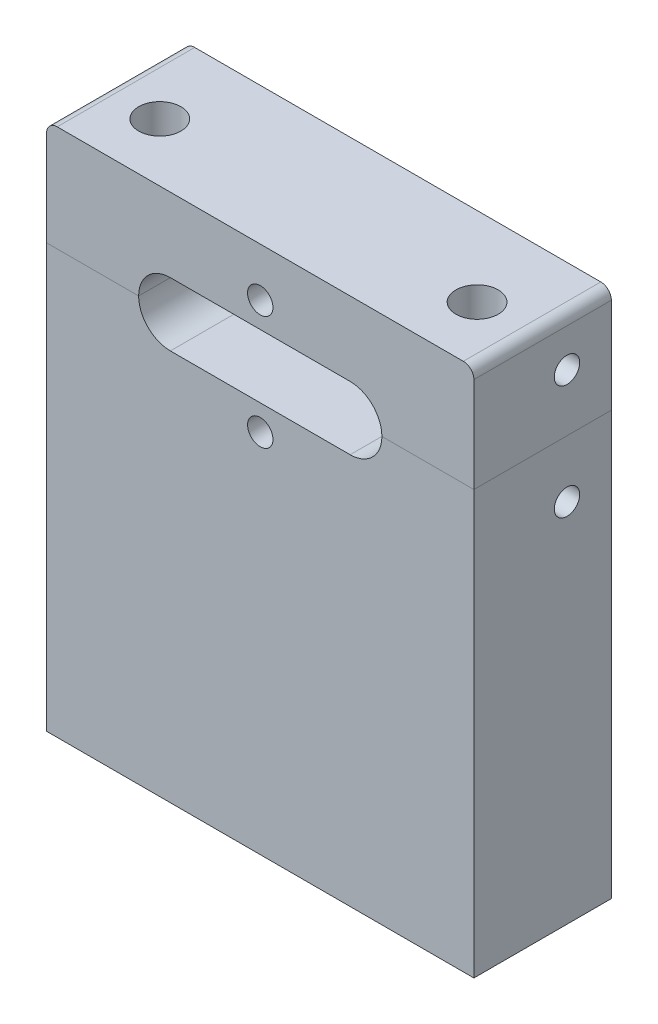
ISO-10303-21;
HEADER;
FILE_DESCRIPTION(('STEP AP214'),'2;1');
FILE_NAME('part.step','',(''),(''),'','','');
FILE_SCHEMA(('AUTOMOTIVE_DESIGN { 1 0 10303 214 1 1 1 1 }'));
ENDSEC;
DATA;
#1=APPLICATION_CONTEXT('core data for automotive mechanical design processes');
#2=APPLICATION_PROTOCOL_DEFINITION('international standard','automotive_design',2000,#1);
#3=PRODUCT_CONTEXT('',#1,'mechanical');
#4=PRODUCT('Part','Part','',(#3));
#5=PRODUCT_RELATED_PRODUCT_CATEGORY('part','',(#4));
#6=PRODUCT_DEFINITION_FORMATION('','',#4);
#7=PRODUCT_DEFINITION_CONTEXT('part definition',#1,'design');
#8=PRODUCT_DEFINITION('design','',#6,#7);
#9=PRODUCT_DEFINITION_SHAPE('','',#8);
#10=(LENGTH_UNIT() NAMED_UNIT(*) SI_UNIT(.MILLI.,.METRE.));
#11=(NAMED_UNIT(*) PLANE_ANGLE_UNIT() SI_UNIT($,.RADIAN.));
#12=(NAMED_UNIT(*) SI_UNIT($,.STERADIAN.) SOLID_ANGLE_UNIT());
#13=UNCERTAINTY_MEASURE_WITH_UNIT(LENGTH_MEASURE(1.E-05),#10,'distance_accuracy_value','');
#14=(GEOMETRIC_REPRESENTATION_CONTEXT(3) GLOBAL_UNCERTAINTY_ASSIGNED_CONTEXT((#13)) GLOBAL_UNIT_ASSIGNED_CONTEXT((#10,
#11,#12)) REPRESENTATION_CONTEXT('',''));
#15=CARTESIAN_POINT('',(0.,0.,0.));
#16=DIRECTION('',(0.,0.,1.));
#17=DIRECTION('',(1.,0.,0.));
#18=AXIS2_PLACEMENT_3D('',#15,#16,#17);
#19=CARTESIAN_POINT('',(0.,25.4,0.));
#20=DIRECTION('',(0.,1.,0.));
#21=DIRECTION('',(0.,0.,1.));
#22=AXIS2_PLACEMENT_3D('',#19,#20,#21);
#23=PLANE('',#22);
#24=DIRECTION('',(0.,0.,-1.));
#25=VECTOR('',#24,1.);
#26=CARTESIAN_POINT('',(-7.3025,25.4,21.2725));
#27=LINE('',#26,#25);
#28=CARTESIAN_POINT('',(-7.3025,25.4,4.1275));
#29=VERTEX_POINT('',#28);
#30=CARTESIAN_POINT('',(-7.3025,25.4,-4.1275));
#31=VERTEX_POINT('',#30);
#32=EDGE_CURVE('E130',#29,#31,#27,.T.);
#33=ORIENTED_EDGE('',*,*,#32,.T.);
#34=DIRECTION('',(-1.,0.,0.));
#35=VECTOR('',#34,1.);
#36=CARTESIAN_POINT('',(-12.827,25.4,-4.1275));
#37=LINE('',#36,#35);
#38=CARTESIAN_POINT('',(-12.827,25.4,-4.1275));
#39=VERTEX_POINT('',#38);
#40=EDGE_CURVE('E125',#31,#39,#37,.T.);
#41=ORIENTED_EDGE('',*,*,#40,.T.);
#42=DIRECTION('',(0.,0.,1.));
#43=VECTOR('',#42,1.);
#44=CARTESIAN_POINT('',(-12.827,25.4,4.1275));
#45=LINE('',#44,#43);
#46=CARTESIAN_POINT('',(-12.827,25.4,4.1275));
#47=VERTEX_POINT('',#46);
#48=EDGE_CURVE('E189',#39,#47,#45,.T.);
#49=ORIENTED_EDGE('',*,*,#48,.T.);
#50=DIRECTION('',(1.,0.,0.));
#51=VECTOR('',#50,1.);
#52=CARTESIAN_POINT('',(-12.827,25.4,4.1275));
#53=LINE('',#52,#51);
#54=EDGE_CURVE('E191',#47,#29,#53,.T.);
#55=ORIENTED_EDGE('',*,*,#54,.T.);
#56=EDGE_LOOP('',(#33,#41,#49,#55));
#57=FACE_BOUND('',#56,.T.);
#58=CARTESIAN_POINT('',(-9.525,25.4,0.635));
#59=DIRECTION('',(0.,1.,0.));
#60=DIRECTION('',(0.,0.,1.));
#61=AXIS2_PLACEMENT_3D('',#58,#59,#60);
#62=CIRCLE('',#61,1.27);
#63=CARTESIAN_POINT('',(-9.525,25.4,1.905));
#64=VERTEX_POINT('',#63);
#65=EDGE_CURVE('E137',#64,#64,#62,.F.);
#66=ORIENTED_EDGE('',*,*,#65,.T.);
#67=EDGE_LOOP('',(#66));
#68=FACE_BOUND('',#67,.T.);
#69=ADVANCED_FACE('F43',(#57,#68),#23,.T.);
#70=CARTESIAN_POINT('',(7.3025,25.4,4.1275));
#71=VERTEX_POINT('',#70);
#72=CARTESIAN_POINT('',(12.827,25.4,4.1275));
#73=VERTEX_POINT('',#72);
#74=EDGE_CURVE('E134',#71,#73,#53,.T.);
#75=ORIENTED_EDGE('',*,*,#74,.T.);
#76=DIRECTION('',(0.,0.,-1.));
#77=VECTOR('',#76,1.);
#78=CARTESIAN_POINT('',(12.827,25.4,4.1275));
#79=LINE('',#78,#77);
#80=CARTESIAN_POINT('',(12.827,25.4,-4.1275));
#81=VERTEX_POINT('',#80);
#82=EDGE_CURVE('E124',#73,#81,#79,.T.);
#83=ORIENTED_EDGE('',*,*,#82,.T.);
#84=CARTESIAN_POINT('',(7.3025,25.4,-4.1275));
#85=VERTEX_POINT('',#84);
#86=EDGE_CURVE('E113',#81,#85,#37,.T.);
#87=ORIENTED_EDGE('',*,*,#86,.T.);
#88=DIRECTION('',(0.,0.,-1.));
#89=VECTOR('',#88,1.);
#90=CARTESIAN_POINT('',(7.3025,25.4,21.2725));
#91=LINE('',#90,#89);
#92=EDGE_CURVE('E122',#85,#71,#91,.F.);
#93=ORIENTED_EDGE('',*,*,#92,.T.);
#94=EDGE_LOOP('',(#75,#83,#87,#93));
#95=FACE_BOUND('',#94,.T.);
#96=CARTESIAN_POINT('',(9.525,25.4,0.635));
#97=DIRECTION('',(0.,1.,0.));
#98=DIRECTION('',(0.,0.,1.));
#99=AXIS2_PLACEMENT_3D('',#96,#97,#98);
#100=CIRCLE('',#99,1.27);
#101=CARTESIAN_POINT('',(9.525,25.4,1.905));
#102=VERTEX_POINT('',#101);
#103=EDGE_CURVE('E131',#102,#102,#100,.F.);
#104=ORIENTED_EDGE('',*,*,#103,.T.);
#105=EDGE_LOOP('',(#104));
#106=FACE_BOUND('',#105,.T.);
#107=ADVANCED_FACE('F120',(#95,#106),#23,.T.);
#108=CARTESIAN_POINT('',(9.525,19.05,0.635));
#109=DIRECTION('',(0.,1.,0.));
#110=DIRECTION('',(0.,0.,1.));
#111=AXIS2_PLACEMENT_3D('',#108,#109,#110);
#112=PLANE('',#111);
#113=CARTESIAN_POINT('',(9.525,19.05,0.635));
#114=DIRECTION('',(0.,1.,0.));
#115=DIRECTION('',(0.,0.,1.));
#116=AXIS2_PLACEMENT_3D('',#113,#114,#115);
#117=CIRCLE('',#116,1.27);
#118=CARTESIAN_POINT('',(9.525,19.05,1.905));
#119=VERTEX_POINT('',#118);
#120=EDGE_CURVE('E52',#119,#119,#117,.T.);
#121=ORIENTED_EDGE('',*,*,#120,.T.);
#122=EDGE_LOOP('',(#121));
#123=FACE_BOUND('',#122,.T.);
#124=ADVANCED_FACE('F225',(#123),#112,.T.);
#125=CARTESIAN_POINT('',(9.525,19.05,0.635));
#126=DIRECTION('',(0.,1.,0.));
#127=DIRECTION('',(0.,0.,1.));
#128=AXIS2_PLACEMENT_3D('',#125,#126,#127);
#129=CYLINDRICAL_SURFACE('',#128,1.27);
#130=ORIENTED_EDGE('',*,*,#120,.F.);
#131=EDGE_LOOP('',(#130));
#132=FACE_BOUND('',#131,.T.);
#133=ORIENTED_EDGE('',*,*,#103,.F.);
#134=EDGE_LOOP('',(#133));
#135=FACE_BOUND('',#134,.T.);
#136=ADVANCED_FACE('F233',(#132,#135),#129,.F.);
#137=CARTESIAN_POINT('',(12.827,31.75,4.1275));
#138=DIRECTION('',(-1.,0.,0.));
#139=DIRECTION('',(0.,0.,1.));
#140=AXIS2_PLACEMENT_3D('',#137,#138,#139);
#141=PLANE('',#140);
#142=CARTESIAN_POINT('',(12.827,21.971,-1.4605));
#143=DIRECTION('',(1.,0.,0.));
#144=DIRECTION('',(0.,0.,-1.));
#145=AXIS2_PLACEMENT_3D('',#142,#143,#144);
#146=CIRCLE('',#145,0.762);
#147=CARTESIAN_POINT('',(12.827,21.971,-2.2225));
#148=VERTEX_POINT('',#147);
#149=EDGE_CURVE('E180',#148,#148,#146,.T.);
#150=ORIENTED_EDGE('',*,*,#149,.F.);
#151=EDGE_LOOP('',(#150));
#152=FACE_BOUND('',#151,.T.);
#153=ORIENTED_EDGE('',*,*,#82,.F.);
#154=DIRECTION('',(0.,-1.,0.));
#155=VECTOR('',#154,1.);
#156=CARTESIAN_POINT('',(12.827,31.75,4.1275));
#157=LINE('',#156,#155);
#158=CARTESIAN_POINT('',(12.827,0.,4.1275));
#159=VERTEX_POINT('',#158);
#160=EDGE_CURVE('E153',#73,#159,#157,.T.);
#161=ORIENTED_EDGE('',*,*,#160,.T.);
#162=DIRECTION('',(0.,0.,-1.));
#163=VECTOR('',#162,1.);
#164=CARTESIAN_POINT('',(12.827,0.,4.1275));
#165=LINE('',#164,#163);
#166=CARTESIAN_POINT('',(12.827,0.,-4.1275));
#167=VERTEX_POINT('',#166);
#168=EDGE_CURVE('E170',#159,#167,#165,.T.);
#169=ORIENTED_EDGE('',*,*,#168,.T.);
#170=DIRECTION('',(0.,-1.,0.));
#171=VECTOR('',#170,1.);
#172=CARTESIAN_POINT('',(12.827,31.75,-4.1275));
#173=LINE('',#172,#171);
#174=EDGE_CURVE('E147',#81,#167,#173,.T.);
#175=ORIENTED_EDGE('',*,*,#174,.F.);
#176=EDGE_LOOP('',(#153,#161,#169,#175));
#177=FACE_BOUND('',#176,.T.);
#178=ADVANCED_FACE('F236',(#152,#177),#141,.F.);
#179=CARTESIAN_POINT('',(-12.827,31.75,-4.1275));
#180=DIRECTION('',(0.,0.,1.));
#181=DIRECTION('',(1.,0.,0.));
#182=AXIS2_PLACEMENT_3D('',#179,#180,#181);
#183=PLANE('',#182);
#184=ORIENTED_EDGE('',*,*,#86,.F.);
#185=ORIENTED_EDGE('',*,*,#174,.T.);
#186=DIRECTION('',(-1.,0.,0.));
#187=VECTOR('',#186,1.);
#188=CARTESIAN_POINT('',(-12.827,0.,-4.1275));
#189=LINE('',#188,#187);
#190=CARTESIAN_POINT('',(-12.827,0.,-4.1275));
#191=VERTEX_POINT('',#190);
#192=EDGE_CURVE('E164',#167,#191,#189,.T.);
#193=ORIENTED_EDGE('',*,*,#192,.T.);
#194=DIRECTION('',(0.,-1.,0.));
#195=VECTOR('',#194,1.);
#196=CARTESIAN_POINT('',(-12.827,31.75,-4.1275));
#197=LINE('',#196,#195);
#198=EDGE_CURVE('E149',#39,#191,#197,.T.);
#199=ORIENTED_EDGE('',*,*,#198,.F.);
#200=ORIENTED_EDGE('',*,*,#40,.F.);
#201=CARTESIAN_POINT('',(-5.3975,25.4,-4.1275));
#202=DIRECTION('',(0.,0.,-1.));
#203=DIRECTION('',(-1.,0.,0.));
#204=AXIS2_PLACEMENT_3D('',#201,#202,#203);
#205=CIRCLE('',#204,1.905);
#206=CARTESIAN_POINT('',(-5.3975,23.495,-4.1275));
#207=VERTEX_POINT('',#206);
#208=EDGE_CURVE('E47',#207,#31,#205,.T.);
#209=ORIENTED_EDGE('',*,*,#208,.F.);
#210=DIRECTION('',(-1.,0.,0.));
#211=VECTOR('',#210,1.);
#212=CARTESIAN_POINT('',(-5.3975,23.495,-4.1275));
#213=LINE('',#212,#211);
#214=CARTESIAN_POINT('',(5.3975,23.495,-4.1275));
#215=VERTEX_POINT('',#214);
#216=EDGE_CURVE('E115',#215,#207,#213,.T.);
#217=ORIENTED_EDGE('',*,*,#216,.F.);
#218=CARTESIAN_POINT('',(5.3975,25.4,-4.1275));
#219=DIRECTION('',(0.,0.,-1.));
#220=DIRECTION('',(-1.,0.,0.));
#221=AXIS2_PLACEMENT_3D('',#218,#219,#220);
#222=CIRCLE('',#221,1.905);
#223=EDGE_CURVE('E60',#85,#215,#222,.T.);
#224=ORIENTED_EDGE('',*,*,#223,.F.);
#225=EDGE_LOOP('',(#184,#185,#193,#199,#200,#209,#217,#224));
#226=FACE_BOUND('',#225,.T.);
#227=ADVANCED_FACE('F112',(#226),#183,.F.);
#228=CARTESIAN_POINT('',(-12.827,31.75,4.1275));
#229=DIRECTION('',(1.,0.,0.));
#230=DIRECTION('',(0.,0.,-1.));
#231=AXIS2_PLACEMENT_3D('',#228,#229,#230);
#232=PLANE('',#231);
#233=ORIENTED_EDGE('',*,*,#48,.F.);
#234=ORIENTED_EDGE('',*,*,#198,.T.);
#235=DIRECTION('',(0.,0.,1.));
#236=VECTOR('',#235,1.);
#237=CARTESIAN_POINT('',(-12.827,0.,4.1275));
#238=LINE('',#237,#236);
#239=CARTESIAN_POINT('',(-12.827,0.,4.1275));
#240=VERTEX_POINT('',#239);
#241=EDGE_CURVE('E158',#191,#240,#238,.T.);
#242=ORIENTED_EDGE('',*,*,#241,.T.);
#243=DIRECTION('',(0.,-1.,0.));
#244=VECTOR('',#243,1.);
#245=CARTESIAN_POINT('',(-12.827,31.75,4.1275));
#246=LINE('',#245,#244);
#247=EDGE_CURVE('E151',#47,#240,#246,.T.);
#248=ORIENTED_EDGE('',*,*,#247,.F.);
#249=EDGE_LOOP('',(#233,#234,#242,#248));
#250=FACE_BOUND('',#249,.T.);
#251=ADVANCED_FACE('F200',(#250),#232,.F.);
#252=CARTESIAN_POINT('',(-12.827,31.75,4.1275));
#253=DIRECTION('',(0.,0.,-1.));
#254=DIRECTION('',(-1.,0.,0.));
#255=AXIS2_PLACEMENT_3D('',#252,#253,#254);
#256=PLANE('',#255);
#257=CARTESIAN_POINT('',(0.,21.971,4.1275));
#258=DIRECTION('',(0.,0.,1.));
#259=DIRECTION('',(1.,0.,0.));
#260=AXIS2_PLACEMENT_3D('',#257,#258,#259);
#261=CIRCLE('',#260,0.762);
#262=CARTESIAN_POINT('',(-0.761999999999999,21.971,4.1275));
#263=VERTEX_POINT('',#262);
#264=EDGE_CURVE('E176',#263,#263,#261,.T.);
#265=ORIENTED_EDGE('',*,*,#264,.F.);
#266=EDGE_LOOP('',(#265));
#267=FACE_BOUND('',#266,.T.);
#268=ORIENTED_EDGE('',*,*,#54,.F.);
#269=ORIENTED_EDGE('',*,*,#247,.T.);
#270=DIRECTION('',(1.,0.,0.));
#271=VECTOR('',#270,1.);
#272=CARTESIAN_POINT('',(-12.827,0.,4.1275));
#273=LINE('',#272,#271);
#274=EDGE_CURVE('E154',#240,#159,#273,.T.);
#275=ORIENTED_EDGE('',*,*,#274,.T.);
#276=ORIENTED_EDGE('',*,*,#160,.F.);
#277=ORIENTED_EDGE('',*,*,#74,.F.);
#278=CARTESIAN_POINT('',(5.3975,25.4,4.1275));
#279=DIRECTION('',(0.,0.,-1.));
#280=DIRECTION('',(-1.,0.,0.));
#281=AXIS2_PLACEMENT_3D('',#278,#279,#280);
#282=CIRCLE('',#281,1.905);
#283=CARTESIAN_POINT('',(5.3975,23.495,4.1275));
#284=VERTEX_POINT('',#283);
#285=EDGE_CURVE('E128',#71,#284,#282,.T.);
#286=ORIENTED_EDGE('',*,*,#285,.T.);
#287=DIRECTION('',(-1.,0.,0.));
#288=VECTOR('',#287,1.);
#289=CARTESIAN_POINT('',(-12.827,23.495,4.1275));
#290=LINE('',#289,#288);
#291=CARTESIAN_POINT('',(-5.3975,23.495,4.1275));
#292=VERTEX_POINT('',#291);
#293=EDGE_CURVE('E145',#284,#292,#290,.T.);
#294=ORIENTED_EDGE('',*,*,#293,.T.);
#295=CARTESIAN_POINT('',(-5.3975,25.4,4.1275));
#296=DIRECTION('',(0.,0.,-1.));
#297=DIRECTION('',(-1.,0.,0.));
#298=AXIS2_PLACEMENT_3D('',#295,#296,#297);
#299=CIRCLE('',#298,1.905);
#300=EDGE_CURVE('E143',#292,#29,#299,.T.);
#301=ORIENTED_EDGE('',*,*,#300,.T.);
#302=EDGE_LOOP('',(#268,#269,#275,#276,#277,#286,#294,#301));
#303=FACE_BOUND('',#302,.T.);
#304=ADVANCED_FACE('F202',(#267,#303),#256,.F.);
#305=CARTESIAN_POINT('',(-5.3975,25.4,21.2725));
#306=DIRECTION('',(0.,0.,-1.));
#307=DIRECTION('',(-1.,0.,0.));
#308=AXIS2_PLACEMENT_3D('',#305,#306,#307);
#309=CYLINDRICAL_SURFACE('',#308,1.905);
#310=ORIENTED_EDGE('',*,*,#32,.F.);
#311=ORIENTED_EDGE('',*,*,#300,.F.);
#312=DIRECTION('',(0.,0.,-1.));
#313=VECTOR('',#312,1.);
#314=CARTESIAN_POINT('',(-5.3975,23.495,21.2725));
#315=LINE('',#314,#313);
#316=EDGE_CURVE('E68',#292,#207,#315,.T.);
#317=ORIENTED_EDGE('',*,*,#316,.T.);
#318=ORIENTED_EDGE('',*,*,#208,.T.);
#319=EDGE_LOOP('',(#310,#311,#317,#318));
#320=FACE_BOUND('',#319,.T.);
#321=ADVANCED_FACE('F45',(#320),#309,.F.);
#322=CARTESIAN_POINT('',(5.3975,25.4,21.2725));
#323=DIRECTION('',(0.,0.,-1.));
#324=DIRECTION('',(-1.,0.,0.));
#325=AXIS2_PLACEMENT_3D('',#322,#323,#324);
#326=CYLINDRICAL_SURFACE('',#325,1.905);
#327=ORIENTED_EDGE('',*,*,#92,.F.);
#328=ORIENTED_EDGE('',*,*,#223,.T.);
#329=DIRECTION('',(0.,0.,-1.));
#330=VECTOR('',#329,1.);
#331=CARTESIAN_POINT('',(5.3975,23.495,21.2725));
#332=LINE('',#331,#330);
#333=EDGE_CURVE('E172',#284,#215,#332,.T.);
#334=ORIENTED_EDGE('',*,*,#333,.F.);
#335=ORIENTED_EDGE('',*,*,#285,.F.);
#336=EDGE_LOOP('',(#327,#328,#334,#335));
#337=FACE_BOUND('',#336,.T.);
#338=ADVANCED_FACE('F127',(#337),#326,.F.);
#339=CARTESIAN_POINT('',(0.,0.,0.));
#340=DIRECTION('',(0.,-1.,0.));
#341=DIRECTION('',(0.,0.,-1.));
#342=AXIS2_PLACEMENT_3D('',#339,#340,#341);
#343=PLANE('',#342);
#344=ORIENTED_EDGE('',*,*,#168,.F.);
#345=ORIENTED_EDGE('',*,*,#274,.F.);
#346=ORIENTED_EDGE('',*,*,#241,.F.);
#347=ORIENTED_EDGE('',*,*,#192,.F.);
#348=EDGE_LOOP('',(#344,#345,#346,#347));
#349=FACE_BOUND('',#348,.T.);
#350=ADVANCED_FACE('F246',(#349),#343,.T.);
#351=CARTESIAN_POINT('',(-5.3975,23.495,21.2725));
#352=DIRECTION('',(0.,-1.,0.));
#353=DIRECTION('',(1.,0.,0.));
#354=AXIS2_PLACEMENT_3D('',#351,#352,#353);
#355=PLANE('',#354);
#356=ORIENTED_EDGE('',*,*,#333,.T.);
#357=ORIENTED_EDGE('',*,*,#216,.T.);
#358=ORIENTED_EDGE('',*,*,#316,.F.);
#359=ORIENTED_EDGE('',*,*,#293,.F.);
#360=EDGE_LOOP('',(#356,#357,#358,#359));
#361=FACE_BOUND('',#360,.T.);
#362=ADVANCED_FACE('F248',(#361),#355,.F.);
#363=CARTESIAN_POINT('',(5.588,21.971,4.1275));
#364=DIRECTION('',(0.,1.,0.));
#365=DIRECTION('',(0.,0.,1.));
#366=AXIS2_PLACEMENT_3D('',#363,#364,#365);
#367=TOROIDAL_SURFACE('',#366,5.588,0.762);
#368=CARTESIAN_POINT('',(5.58800000000002,21.971,-1.4605));
#369=DIRECTION('',(-1.,0.,0.));
#370=DIRECTION('',(0.,0.,1.));
#371=AXIS2_PLACEMENT_3D('',#368,#369,#370);
#372=CIRCLE('',#371,0.762);
#373=CARTESIAN_POINT('',(5.58800000000002,21.971,-2.2225));
#374=VERTEX_POINT('',#373);
#375=EDGE_CURVE('E179',#374,#374,#372,.F.);
#376=CARTESIAN_POINT('',(5.588,21.971,4.1275));
#377=DIRECTION('',(0.,1.,0.));
#378=DIRECTION('',(0.,0.,1.));
#379=AXIS2_PLACEMENT_3D('',#376,#377,#378);
#380=CIRCLE('',#379,6.35);
#381=EDGE_CURVE('',#374,#263,#380,.T.);
#382=ORIENTED_EDGE('',*,*,#375,.T.);
#383=ORIENTED_EDGE('',*,*,#264,.T.);
#384=ORIENTED_EDGE('',*,*,#381,.T.);
#385=ORIENTED_EDGE('',*,*,#381,.F.);
#386=EDGE_LOOP('',(#382,#384,#383,#385));
#387=FACE_BOUND('',#386,.T.);
#388=ADVANCED_FACE('F226',(#387),#367,.F.);
#389=CARTESIAN_POINT('',(-12.828,21.971,-1.4605));
#390=DIRECTION('',(1.,0.,0.));
#391=DIRECTION('',(0.,0.,-1.));
#392=AXIS2_PLACEMENT_3D('',#389,#390,#391);
#393=CYLINDRICAL_SURFACE('',#392,0.762);
#394=CARTESIAN_POINT('',(5.58800000000002,21.971,-2.2225));
#395=CARTESIAN_POINT('',(5.66340625000003,21.971,-2.2225));
#396=CARTESIAN_POINT('',(5.73881250000002,21.971,-2.2225));
#397=CARTESIAN_POINT('',(5.88962500000003,21.971,-2.2225));
#398=CARTESIAN_POINT('',(5.96503125000002,21.971,-2.2225));
#399=CARTESIAN_POINT('',(6.11584375000002,21.971,-2.2225));
#400=CARTESIAN_POINT('',(6.19125000000002,21.971,-2.2225));
#401=CARTESIAN_POINT('',(6.34206250000002,21.971,-2.2225));
#402=CARTESIAN_POINT('',(6.41746875000002,21.971,-2.2225));
#403=CARTESIAN_POINT('',(6.56828125000002,21.971,-2.2225));
#404=CARTESIAN_POINT('',(6.64368750000002,21.971,-2.2225));
#405=CARTESIAN_POINT('',(6.79450000000002,21.971,-2.2225));
#406=CARTESIAN_POINT('',(6.86990625000002,21.971,-2.2225));
#407=CARTESIAN_POINT('',(7.02071875000002,21.971,-2.2225));
#408=CARTESIAN_POINT('',(7.09612500000002,21.971,-2.2225));
#409=CARTESIAN_POINT('',(7.24693750000002,21.971,-2.2225));
#410=CARTESIAN_POINT('',(7.32234375000002,21.971,-2.2225));
#411=CARTESIAN_POINT('',(7.47315625000002,21.971,-2.2225));
#412=CARTESIAN_POINT('',(7.54856250000002,21.971,-2.2225));
#413=CARTESIAN_POINT('',(7.69937500000002,21.971,-2.2225));
#414=CARTESIAN_POINT('',(7.77478125000002,21.971,-2.2225));
#415=CARTESIAN_POINT('',(7.92559375000002,21.971,-2.2225));
#416=CARTESIAN_POINT('',(8.00100000000002,21.971,-2.2225));
#417=CARTESIAN_POINT('',(8.15181250000001,21.971,-2.2225));
#418=CARTESIAN_POINT('',(8.22721875000001,21.971,-2.2225));
#419=CARTESIAN_POINT('',(8.37803125000001,21.971,-2.2225));
#420=CARTESIAN_POINT('',(8.45343750000001,21.971,-2.2225));
#421=CARTESIAN_POINT('',(8.60425000000001,21.971,-2.2225));
#422=CARTESIAN_POINT('',(8.67965625000001,21.971,-2.2225));
#423=CARTESIAN_POINT('',(8.83046875000001,21.971,-2.2225));
#424=CARTESIAN_POINT('',(8.90587500000001,21.971,-2.2225));
#425=CARTESIAN_POINT('',(9.05668750000001,21.971,-2.2225));
#426=CARTESIAN_POINT('',(9.13209375000001,21.971,-2.2225));
#427=CARTESIAN_POINT('',(9.28290625000001,21.971,-2.2225));
#428=CARTESIAN_POINT('',(9.35831250000001,21.971,-2.2225));
#429=CARTESIAN_POINT('',(9.50912500000001,21.971,-2.2225));
#430=CARTESIAN_POINT('',(9.58453125000001,21.971,-2.2225));
#431=CARTESIAN_POINT('',(9.73534375000001,21.971,-2.2225));
#432=CARTESIAN_POINT('',(9.81075000000001,21.971,-2.2225));
#433=CARTESIAN_POINT('',(9.9615625,21.971,-2.2225));
#434=CARTESIAN_POINT('',(10.03696875,21.971,-2.2225));
#435=CARTESIAN_POINT('',(10.18778125,21.971,-2.2225));
#436=CARTESIAN_POINT('',(10.2631875,21.971,-2.2225));
#437=CARTESIAN_POINT('',(10.414,21.971,-2.2225));
#438=CARTESIAN_POINT('',(10.48940625,21.971,-2.2225));
#439=CARTESIAN_POINT('',(10.64021875,21.971,-2.2225));
#440=CARTESIAN_POINT('',(10.715625,21.971,-2.2225));
#441=CARTESIAN_POINT('',(10.8664375,21.971,-2.2225));
#442=CARTESIAN_POINT('',(10.94184375,21.971,-2.2225));
#443=CARTESIAN_POINT('',(11.09265625,21.971,-2.2225));
#444=CARTESIAN_POINT('',(11.1680625,21.971,-2.2225));
#445=CARTESIAN_POINT('',(11.318875,21.971,-2.2225));
#446=CARTESIAN_POINT('',(11.39428125,21.971,-2.2225));
#447=CARTESIAN_POINT('',(11.54509375,21.971,-2.2225));
#448=CARTESIAN_POINT('',(11.6205,21.971,-2.2225));
#449=CARTESIAN_POINT('',(11.7713125,21.971,-2.2225));
#450=CARTESIAN_POINT('',(11.84671875,21.971,-2.2225));
#451=CARTESIAN_POINT('',(11.99753125,21.971,-2.2225));
#452=CARTESIAN_POINT('',(12.0729375,21.971,-2.2225));
#453=CARTESIAN_POINT('',(12.22375,21.971,-2.2225));
#454=CARTESIAN_POINT('',(12.29915625,21.971,-2.2225));
#455=CARTESIAN_POINT('',(12.44996875,21.971,-2.2225));
#456=CARTESIAN_POINT('',(12.525375,21.971,-2.2225));
#457=CARTESIAN_POINT('',(12.6761875,21.971,-2.2225));
#458=CARTESIAN_POINT('',(12.75159375,21.971,-2.2225));
#459=CARTESIAN_POINT('',(12.827,21.971,-2.2225));
#460=B_SPLINE_CURVE_WITH_KNOTS('',3,(#394,#395,#396,#397,#398,#399,#400,#401,#402,#403,#404,
#405,#406,#407,#408,#409,#410,#411,#412,#413,#414,#415,#416,#417,#418,#419,#420,#421,#422,#423,
#424,#425,#426,#427,#428,#429,#430,#431,#432,#433,#434,#435,#436,#437,#438,#439,#440,#441,#442,
#443,#444,#445,#446,#447,#448,#449,#450,#451,#452,#453,#454,#455,#456,#457,#458,#459),
.UNSPECIFIED.,.F.,.F.,(4,2,2,2,2,2,2,2,2,2,2,2,2,2,2,2,2,2,2,2,2,2,2,2,2,2,2,2,2,2,2,2,4),(0.,
0.22621875,0.4524375,0.678656249999996,0.904874999999996,1.13109375,1.35731249999999,
1.58353124999999,1.80974999999999,2.03596874999999,2.26218749999999,2.48840624999999,
2.71462499999999,2.94084374999999,3.16706249999998,3.39328124999998,3.61949999999998,
3.84571874999998,4.07193749999998,4.29815624999998,4.52437499999998,4.75059374999998,
4.97681249999998,5.20303124999998,5.42924999999998,5.65546874999998,5.88168749999998,
6.10790624999997,6.33412499999997,6.56034374999997,6.78656249999997,7.01278124999997,
7.23899999999997),.UNSPECIFIED.);
#461=EDGE_CURVE('BSEAM216',#374,#148,#460,.T.);
#462=ORIENTED_EDGE('',*,*,#375,.F.);
#463=ORIENTED_EDGE('',*,*,#149,.T.);
#464=ORIENTED_EDGE('',*,*,#461,.T.);
#465=ORIENTED_EDGE('',*,*,#461,.F.);
#466=EDGE_LOOP('',(#462,#464,#463,#465));
#467=FACE_BOUND('',#466,.T.);
#468=ADVANCED_FACE('F216',(#467),#393,.F.);
#469=CARTESIAN_POINT('',(-9.525,19.05,0.635));
#470=DIRECTION('',(0.,1.,0.));
#471=DIRECTION('',(0.,0.,1.));
#472=AXIS2_PLACEMENT_3D('',#469,#470,#471);
#473=PLANE('',#472);
#474=CARTESIAN_POINT('',(-9.525,19.05,0.635));
#475=DIRECTION('',(0.,1.,0.));
#476=DIRECTION('',(0.,0.,1.));
#477=AXIS2_PLACEMENT_3D('',#474,#475,#476);
#478=CIRCLE('',#477,1.27);
#479=CARTESIAN_POINT('',(-9.525,19.05,1.905));
#480=VERTEX_POINT('',#479);
#481=EDGE_CURVE('E13',#480,#480,#478,.T.);
#482=ORIENTED_EDGE('',*,*,#481,.T.);
#483=EDGE_LOOP('',(#482));
#484=FACE_BOUND('',#483,.T.);
#485=ADVANCED_FACE('F213',(#484),#473,.T.);
#486=CARTESIAN_POINT('',(-9.525,19.05,0.635));
#487=DIRECTION('',(0.,1.,0.));
#488=DIRECTION('',(0.,0.,1.));
#489=AXIS2_PLACEMENT_3D('',#486,#487,#488);
#490=CYLINDRICAL_SURFACE('',#489,1.27);
#491=ORIENTED_EDGE('',*,*,#481,.F.);
#492=EDGE_LOOP('',(#491));
#493=FACE_BOUND('',#492,.T.);
#494=ORIENTED_EDGE('',*,*,#65,.F.);
#495=EDGE_LOOP('',(#494));
#496=FACE_BOUND('',#495,.T.);
#497=ADVANCED_FACE('F215',(#493,#496),#490,.F.);
#498=CLOSED_SHELL('',(#69,#107,#124,#136,#178,#227,#251,#304,#321,#338,#350,#362,#388,#468,#485,#497));
#499=MANIFOLD_SOLID_BREP('B2',#498);
#500=CARTESIAN_POINT('',(0.,25.4,0.));
#501=DIRECTION('',(0.,1.,0.));
#502=DIRECTION('',(0.,0.,1.));
#503=AXIS2_PLACEMENT_3D('',#500,#501,#502);
#504=PLANE('',#503);
#505=CARTESIAN_POINT('',(9.525,25.4,0.635));
#506=DIRECTION('',(0.,1.,0.));
#507=DIRECTION('',(0.,0.,1.));
#508=AXIS2_PLACEMENT_3D('',#505,#506,#507);
#509=CIRCLE('',#508,1.27);
#510=CARTESIAN_POINT('',(9.525,25.4,1.905));
#511=VERTEX_POINT('',#510);
#512=EDGE_CURVE('E510',#511,#511,#509,.F.);
#513=ORIENTED_EDGE('',*,*,#512,.F.);
#514=EDGE_LOOP('',(#513));
#515=FACE_BOUND('',#514,.T.);
#516=DIRECTION('',(1.,0.,0.));
#517=VECTOR('',#516,1.);
#518=CARTESIAN_POINT('',(-12.827,25.4,4.1275));
#519=LINE('',#518,#517);
#520=CARTESIAN_POINT('',(7.3025,25.4,4.1275));
#521=VERTEX_POINT('',#520);
#522=CARTESIAN_POINT('',(12.827,25.4,4.1275));
#523=VERTEX_POINT('',#522);
#524=EDGE_CURVE('E518',#521,#523,#519,.T.);
#525=ORIENTED_EDGE('',*,*,#524,.F.);
#526=DIRECTION('',(0.,0.,-1.));
#527=VECTOR('',#526,1.);
#528=CARTESIAN_POINT('',(7.3025,25.4,21.2725));
#529=LINE('',#528,#527);
#530=CARTESIAN_POINT('',(7.3025,25.4,-4.1275));
#531=VERTEX_POINT('',#530);
#532=EDGE_CURVE('E513',#531,#521,#529,.F.);
#533=ORIENTED_EDGE('',*,*,#532,.F.);
#534=DIRECTION('',(-1.,0.,0.));
#535=VECTOR('',#534,1.);
#536=CARTESIAN_POINT('',(-12.827,25.4,-4.1275));
#537=LINE('',#536,#535);
#538=CARTESIAN_POINT('',(12.827,25.4,-4.1275));
#539=VERTEX_POINT('',#538);
#540=EDGE_CURVE('E372',#539,#531,#537,.T.);
#541=ORIENTED_EDGE('',*,*,#540,.F.);
#542=DIRECTION('',(0.,0.,-1.));
#543=VECTOR('',#542,1.);
#544=CARTESIAN_POINT('',(12.827,25.4,4.1275));
#545=LINE('',#544,#543);
#546=EDGE_CURVE('E41',#523,#539,#545,.T.);
#547=ORIENTED_EDGE('',*,*,#546,.F.);
#548=EDGE_LOOP('',(#525,#533,#541,#547));
#549=FACE_BOUND('',#548,.T.);
#550=ADVANCED_FACE('F363',(#515,#549),#504,.F.);
#551=CARTESIAN_POINT('',(-9.525,25.4,0.635));
#552=DIRECTION('',(0.,1.,0.));
#553=DIRECTION('',(0.,0.,1.));
#554=AXIS2_PLACEMENT_3D('',#551,#552,#553);
#555=CIRCLE('',#554,1.27);
#556=CARTESIAN_POINT('',(-9.525,25.4,1.905));
#557=VERTEX_POINT('',#556);
#558=EDGE_CURVE('E507',#557,#557,#555,.F.);
#559=ORIENTED_EDGE('',*,*,#558,.F.);
#560=EDGE_LOOP('',(#559));
#561=FACE_BOUND('',#560,.T.);
#562=DIRECTION('',(0.,0.,-1.));
#563=VECTOR('',#562,1.);
#564=CARTESIAN_POINT('',(-7.3025,25.4,21.2725));
#565=LINE('',#564,#563);
#566=CARTESIAN_POINT('',(-7.3025,25.4,4.1275));
#567=VERTEX_POINT('',#566);
#568=CARTESIAN_POINT('',(-7.3025,25.4,-4.1275));
#569=VERTEX_POINT('',#568);
#570=EDGE_CURVE('E515',#567,#569,#565,.T.);
#571=ORIENTED_EDGE('',*,*,#570,.F.);
#572=CARTESIAN_POINT('',(-12.827,25.4,4.1275));
#573=VERTEX_POINT('',#572);
#574=EDGE_CURVE('E516',#573,#567,#519,.T.);
#575=ORIENTED_EDGE('',*,*,#574,.F.);
#576=DIRECTION('',(0.,0.,1.));
#577=VECTOR('',#576,1.);
#578=CARTESIAN_POINT('',(-12.827,25.4,4.1275));
#579=LINE('',#578,#577);
#580=CARTESIAN_POINT('',(-12.827,25.4,-4.1275));
#581=VERTEX_POINT('',#580);
#582=EDGE_CURVE('E367',#581,#573,#579,.T.);
#583=ORIENTED_EDGE('',*,*,#582,.F.);
#584=EDGE_CURVE('E386',#569,#581,#537,.T.);
#585=ORIENTED_EDGE('',*,*,#584,.F.);
#586=EDGE_LOOP('',(#571,#575,#583,#585));
#587=FACE_BOUND('',#586,.T.);
#588=ADVANCED_FACE('F365',(#561,#587),#504,.F.);
#589=CARTESIAN_POINT('',(-12.828,28.829,-1.4605));
#590=DIRECTION('',(1.,0.,0.));
#591=DIRECTION('',(0.,0.,-1.));
#592=AXIS2_PLACEMENT_3D('',#589,#590,#591);
#593=CYLINDRICAL_SURFACE('',#592,0.762);
#594=CARTESIAN_POINT('',(5.58800000000002,28.829,-1.4605));
#595=DIRECTION('',(-1.,0.,0.));
#596=DIRECTION('',(0.,0.,1.));
#597=AXIS2_PLACEMENT_3D('',#594,#595,#596);
#598=CIRCLE('',#597,0.762);
#599=CARTESIAN_POINT('',(5.58800000000002,28.829,-2.2225));
#600=VERTEX_POINT('',#599);
#601=EDGE_CURVE('E552',#600,#600,#598,.F.);
#602=CARTESIAN_POINT('',(12.827,28.829,-1.4605));
#603=DIRECTION('',(1.,0.,0.));
#604=DIRECTION('',(0.,0.,-1.));
#605=AXIS2_PLACEMENT_3D('',#602,#603,#604);
#606=CIRCLE('',#605,0.762);
#607=CARTESIAN_POINT('',(12.827,28.829,-2.2225));
#608=VERTEX_POINT('',#607);
#609=EDGE_CURVE('E555',#608,#608,#606,.T.);
#610=CARTESIAN_POINT('',(5.58800000000002,28.829,-2.2225));
#611=CARTESIAN_POINT('',(5.66340625000003,28.829,-2.2225));
#612=CARTESIAN_POINT('',(5.73881250000002,28.829,-2.2225));
#613=CARTESIAN_POINT('',(5.88962500000003,28.829,-2.2225));
#614=CARTESIAN_POINT('',(5.96503125000002,28.829,-2.2225));
#615=CARTESIAN_POINT('',(6.11584375000002,28.829,-2.2225));
#616=CARTESIAN_POINT('',(6.19125000000002,28.829,-2.2225));
#617=CARTESIAN_POINT('',(6.34206250000002,28.829,-2.2225));
#618=CARTESIAN_POINT('',(6.41746875000002,28.829,-2.2225));
#619=CARTESIAN_POINT('',(6.56828125000002,28.829,-2.2225));
#620=CARTESIAN_POINT('',(6.64368750000002,28.829,-2.2225));
#621=CARTESIAN_POINT('',(6.79450000000002,28.829,-2.2225));
#622=CARTESIAN_POINT('',(6.86990625000002,28.829,-2.2225));
#623=CARTESIAN_POINT('',(7.02071875000002,28.829,-2.2225));
#624=CARTESIAN_POINT('',(7.09612500000002,28.829,-2.2225));
#625=CARTESIAN_POINT('',(7.24693750000002,28.829,-2.2225));
#626=CARTESIAN_POINT('',(7.32234375000002,28.829,-2.2225));
#627=CARTESIAN_POINT('',(7.47315625000002,28.829,-2.2225));
#628=CARTESIAN_POINT('',(7.54856250000002,28.829,-2.2225));
#629=CARTESIAN_POINT('',(7.69937500000002,28.829,-2.2225));
#630=CARTESIAN_POINT('',(7.77478125000002,28.829,-2.2225));
#631=CARTESIAN_POINT('',(7.92559375000002,28.829,-2.2225));
#632=CARTESIAN_POINT('',(8.00100000000002,28.829,-2.2225));
#633=CARTESIAN_POINT('',(8.15181250000001,28.829,-2.2225));
#634=CARTESIAN_POINT('',(8.22721875000001,28.829,-2.2225));
#635=CARTESIAN_POINT('',(8.37803125000001,28.829,-2.2225));
#636=CARTESIAN_POINT('',(8.45343750000001,28.829,-2.2225));
#637=CARTESIAN_POINT('',(8.60425000000001,28.829,-2.2225));
#638=CARTESIAN_POINT('',(8.67965625000001,28.829,-2.2225));
#639=CARTESIAN_POINT('',(8.83046875000001,28.829,-2.2225));
#640=CARTESIAN_POINT('',(8.90587500000001,28.829,-2.2225));
#641=CARTESIAN_POINT('',(9.05668750000001,28.829,-2.2225));
#642=CARTESIAN_POINT('',(9.13209375000001,28.829,-2.2225));
#643=CARTESIAN_POINT('',(9.28290625000001,28.829,-2.2225));
#644=CARTESIAN_POINT('',(9.35831250000001,28.829,-2.2225));
#645=CARTESIAN_POINT('',(9.50912500000001,28.829,-2.2225));
#646=CARTESIAN_POINT('',(9.58453125000001,28.829,-2.2225));
#647=CARTESIAN_POINT('',(9.73534375000001,28.829,-2.2225));
#648=CARTESIAN_POINT('',(9.81075000000001,28.829,-2.2225));
#649=CARTESIAN_POINT('',(9.9615625,28.829,-2.2225));
#650=CARTESIAN_POINT('',(10.03696875,28.829,-2.2225));
#651=CARTESIAN_POINT('',(10.18778125,28.829,-2.2225));
#652=CARTESIAN_POINT('',(10.2631875,28.829,-2.2225));
#653=CARTESIAN_POINT('',(10.414,28.829,-2.2225));
#654=CARTESIAN_POINT('',(10.48940625,28.829,-2.2225));
#655=CARTESIAN_POINT('',(10.64021875,28.829,-2.2225));
#656=CARTESIAN_POINT('',(10.715625,28.829,-2.2225));
#657=CARTESIAN_POINT('',(10.8664375,28.829,-2.2225));
#658=CARTESIAN_POINT('',(10.94184375,28.829,-2.2225));
#659=CARTESIAN_POINT('',(11.09265625,28.829,-2.2225));
#660=CARTESIAN_POINT('',(11.1680625,28.829,-2.2225));
#661=CARTESIAN_POINT('',(11.318875,28.829,-2.2225));
#662=CARTESIAN_POINT('',(11.39428125,28.829,-2.2225));
#663=CARTESIAN_POINT('',(11.54509375,28.829,-2.2225));
#664=CARTESIAN_POINT('',(11.6205,28.829,-2.2225));
#665=CARTESIAN_POINT('',(11.7713125,28.829,-2.2225));
#666=CARTESIAN_POINT('',(11.84671875,28.829,-2.2225));
#667=CARTESIAN_POINT('',(11.99753125,28.829,-2.2225));
#668=CARTESIAN_POINT('',(12.0729375,28.829,-2.2225));
#669=CARTESIAN_POINT('',(12.22375,28.829,-2.2225));
#670=CARTESIAN_POINT('',(12.29915625,28.829,-2.2225));
#671=CARTESIAN_POINT('',(12.44996875,28.829,-2.2225));
#672=CARTESIAN_POINT('',(12.525375,28.829,-2.2225));
#673=CARTESIAN_POINT('',(12.6761875,28.829,-2.2225));
#674=CARTESIAN_POINT('',(12.75159375,28.829,-2.2225));
#675=CARTESIAN_POINT('',(12.827,28.829,-2.2225));
#676=B_SPLINE_CURVE_WITH_KNOTS('',3,(#610,#611,#612,#613,#614,#615,#616,#617,#618,#619,#620,
#621,#622,#623,#624,#625,#626,#627,#628,#629,#630,#631,#632,#633,#634,#635,#636,#637,#638,#639,
#640,#641,#642,#643,#644,#645,#646,#647,#648,#649,#650,#651,#652,#653,#654,#655,#656,#657,#658,
#659,#660,#661,#662,#663,#664,#665,#666,#667,#668,#669,#670,#671,#672,#673,#674,#675),
.UNSPECIFIED.,.F.,.F.,(4,2,2,2,2,2,2,2,2,2,2,2,2,2,2,2,2,2,2,2,2,2,2,2,2,2,2,2,2,2,2,2,4),(0.,
0.22621875,0.4524375,0.678656249999996,0.904874999999996,1.13109375,1.35731249999999,
1.58353124999999,1.80974999999999,2.03596874999999,2.26218749999999,2.48840624999999,
2.71462499999999,2.94084374999999,3.16706249999998,3.39328124999998,3.61949999999998,
3.84571874999998,4.07193749999998,4.29815624999998,4.52437499999998,4.75059374999998,
4.97681249999998,5.20303124999998,5.42924999999998,5.65546874999998,5.88168749999998,
6.10790624999997,6.33412499999997,6.56034374999997,6.78656249999997,7.01278124999997,
7.23899999999997),.UNSPECIFIED.);
#677=EDGE_CURVE('BSEAM592',#600,#608,#676,.T.);
#678=ORIENTED_EDGE('',*,*,#601,.F.);
#679=ORIENTED_EDGE('',*,*,#609,.T.);
#680=ORIENTED_EDGE('',*,*,#677,.T.);
#681=ORIENTED_EDGE('',*,*,#677,.F.);
#682=EDGE_LOOP('',(#678,#680,#679,#681));
#683=FACE_BOUND('',#682,.T.);
#684=ADVANCED_FACE('F592',(#683),#593,.F.);
#685=CARTESIAN_POINT('',(-12.192,31.115,0.));
#686=DIRECTION('',(0.,0.,1.));
#687=DIRECTION('',(1.,0.,0.));
#688=AXIS2_PLACEMENT_3D('',#685,#686,#687);
#689=CYLINDRICAL_SURFACE('',#688,0.635);
#690=CARTESIAN_POINT('',(-12.192,31.115,-4.1275));
#691=DIRECTION('',(0.,0.,1.));
#692=DIRECTION('',(1.,0.,0.));
#693=AXIS2_PLACEMENT_3D('',#690,#691,#692);
#694=CIRCLE('',#693,0.635);
#695=CARTESIAN_POINT('',(-12.827,31.115,-4.1275));
#696=VERTEX_POINT('',#695);
#697=CARTESIAN_POINT('',(-12.192,31.75,-4.1275));
#698=VERTEX_POINT('',#697);
#699=EDGE_CURVE('E503',#696,#698,#694,.F.);
#700=ORIENTED_EDGE('',*,*,#699,.F.);
#701=DIRECTION('',(0.,0.,1.));
#702=VECTOR('',#701,1.);
#703=CARTESIAN_POINT('',(-12.827,31.115,4.1275));
#704=LINE('',#703,#702);
#705=CARTESIAN_POINT('',(-12.827,31.115,4.1275));
#706=VERTEX_POINT('',#705);
#707=EDGE_CURVE('E499',#706,#696,#704,.F.);
#708=ORIENTED_EDGE('',*,*,#707,.F.);
#709=CARTESIAN_POINT('',(-12.192,31.115,4.1275));
#710=DIRECTION('',(0.,0.,-1.));
#711=DIRECTION('',(-1.,0.,0.));
#712=AXIS2_PLACEMENT_3D('',#709,#710,#711);
#713=CIRCLE('',#712,0.635);
#714=CARTESIAN_POINT('',(-12.192,31.75,4.1275));
#715=VERTEX_POINT('',#714);
#716=EDGE_CURVE('E497',#715,#706,#713,.F.);
#717=ORIENTED_EDGE('',*,*,#716,.F.);
#718=DIRECTION('',(0.,0.,1.));
#719=VECTOR('',#718,1.);
#720=CARTESIAN_POINT('',(-12.192,31.75,0.));
#721=LINE('',#720,#719);
#722=EDGE_CURVE('E492',#698,#715,#721,.T.);
#723=ORIENTED_EDGE('',*,*,#722,.F.);
#724=EDGE_LOOP('',(#700,#708,#717,#723));
#725=FACE_BOUND('',#724,.T.);
#726=ADVANCED_FACE('F542',(#725),#689,.T.);
#727=CARTESIAN_POINT('',(0.,31.75,0.));
#728=DIRECTION('',(0.,-1.,0.));
#729=DIRECTION('',(0.,0.,-1.));
#730=AXIS2_PLACEMENT_3D('',#727,#728,#729);
#731=PLANE('',#730);
#732=CARTESIAN_POINT('',(-9.525,31.75,0.635));
#733=DIRECTION('',(0.,1.,0.));
#734=DIRECTION('',(0.,0.,1.));
#735=AXIS2_PLACEMENT_3D('',#732,#733,#734);
#736=CIRCLE('',#735,1.27);
#737=CARTESIAN_POINT('',(-9.525,31.75,1.905));
#738=VERTEX_POINT('',#737);
#739=EDGE_CURVE('E563',#738,#738,#736,.T.);
#740=ORIENTED_EDGE('',*,*,#739,.F.);
#741=EDGE_LOOP('',(#740));
#742=FACE_BOUND('',#741,.T.);
#743=CARTESIAN_POINT('',(9.525,31.75,0.635));
#744=DIRECTION('',(0.,1.,0.));
#745=DIRECTION('',(0.,0.,1.));
#746=AXIS2_PLACEMENT_3D('',#743,#744,#745);
#747=CIRCLE('',#746,1.27);
#748=CARTESIAN_POINT('',(9.525,31.75,1.905));
#749=VERTEX_POINT('',#748);
#750=EDGE_CURVE('E558',#749,#749,#747,.T.);
#751=ORIENTED_EDGE('',*,*,#750,.F.);
#752=EDGE_LOOP('',(#751));
#753=FACE_BOUND('',#752,.T.);
#754=DIRECTION('',(-1.,0.,0.));
#755=VECTOR('',#754,1.);
#756=CARTESIAN_POINT('',(-12.827,31.75,-4.1275));
#757=LINE('',#756,#755);
#758=CARTESIAN_POINT('',(12.192,31.75,-4.1275));
#759=VERTEX_POINT('',#758);
#760=EDGE_CURVE('E452',#759,#698,#757,.T.);
#761=ORIENTED_EDGE('',*,*,#760,.T.);
#762=ORIENTED_EDGE('',*,*,#722,.T.);
#763=DIRECTION('',(1.,0.,0.));
#764=VECTOR('',#763,1.);
#765=CARTESIAN_POINT('',(-12.827,31.75,4.1275));
#766=LINE('',#765,#764);
#767=CARTESIAN_POINT('',(12.192,31.75,4.1275));
#768=VERTEX_POINT('',#767);
#769=EDGE_CURVE('E471',#715,#768,#766,.T.);
#770=ORIENTED_EDGE('',*,*,#769,.T.);
#771=DIRECTION('',(0.,0.,-1.));
#772=VECTOR('',#771,1.);
#773=CARTESIAN_POINT('',(12.192,31.75,0.));
#774=LINE('',#773,#772);
#775=EDGE_CURVE('E489',#768,#759,#774,.T.);
#776=ORIENTED_EDGE('',*,*,#775,.T.);
#777=EDGE_LOOP('',(#761,#762,#770,#776));
#778=FACE_BOUND('',#777,.T.);
#779=ADVANCED_FACE('F537',(#742,#753,#778),#731,.F.);
#780=CARTESIAN_POINT('',(-9.525,19.05,0.635));
#781=DIRECTION('',(0.,1.,0.));
#782=DIRECTION('',(0.,0.,1.));
#783=AXIS2_PLACEMENT_3D('',#780,#781,#782);
#784=CYLINDRICAL_SURFACE('',#783,1.27);
#785=ORIENTED_EDGE('',*,*,#558,.T.);
#786=EDGE_LOOP('',(#785));
#787=FACE_BOUND('',#786,.T.);
#788=ORIENTED_EDGE('',*,*,#739,.T.);
#789=EDGE_LOOP('',(#788));
#790=FACE_BOUND('',#789,.T.);
#791=ADVANCED_FACE('F567',(#787,#790),#784,.F.);
#792=CARTESIAN_POINT('',(9.525,19.05,0.635));
#793=DIRECTION('',(0.,1.,0.));
#794=DIRECTION('',(0.,0.,1.));
#795=AXIS2_PLACEMENT_3D('',#792,#793,#794);
#796=CYLINDRICAL_SURFACE('',#795,1.27);
#797=ORIENTED_EDGE('',*,*,#512,.T.);
#798=EDGE_LOOP('',(#797));
#799=FACE_BOUND('',#798,.T.);
#800=ORIENTED_EDGE('',*,*,#750,.T.);
#801=EDGE_LOOP('',(#800));
#802=FACE_BOUND('',#801,.T.);
#803=ADVANCED_FACE('F574',(#799,#802),#796,.F.);
#804=CARTESIAN_POINT('',(12.192,31.115,0.));
#805=DIRECTION('',(0.,0.,-1.));
#806=DIRECTION('',(-1.,0.,0.));
#807=AXIS2_PLACEMENT_3D('',#804,#805,#806);
#808=CYLINDRICAL_SURFACE('',#807,0.635);
#809=CARTESIAN_POINT('',(12.192,31.115,4.1275));
#810=DIRECTION('',(0.,0.,-1.));
#811=DIRECTION('',(-1.,0.,0.));
#812=AXIS2_PLACEMENT_3D('',#809,#810,#811);
#813=CIRCLE('',#812,0.635);
#814=CARTESIAN_POINT('',(12.827,31.115,4.1275));
#815=VERTEX_POINT('',#814);
#816=EDGE_CURVE('E495',#815,#768,#813,.F.);
#817=ORIENTED_EDGE('',*,*,#816,.F.);
#818=DIRECTION('',(0.,0.,-1.));
#819=VECTOR('',#818,1.);
#820=CARTESIAN_POINT('',(12.827,31.115,4.1275));
#821=LINE('',#820,#819);
#822=CARTESIAN_POINT('',(12.827,31.115,-4.1275));
#823=VERTEX_POINT('',#822);
#824=EDGE_CURVE('E505',#823,#815,#821,.F.);
#825=ORIENTED_EDGE('',*,*,#824,.F.);
#826=CARTESIAN_POINT('',(12.192,31.115,-4.1275));
#827=DIRECTION('',(0.,0.,1.));
#828=DIRECTION('',(1.,0.,0.));
#829=AXIS2_PLACEMENT_3D('',#826,#827,#828);
#830=CIRCLE('',#829,0.635);
#831=EDGE_CURVE('E501',#759,#823,#830,.F.);
#832=ORIENTED_EDGE('',*,*,#831,.F.);
#833=ORIENTED_EDGE('',*,*,#775,.F.);
#834=EDGE_LOOP('',(#817,#825,#832,#833));
#835=FACE_BOUND('',#834,.T.);
#836=ADVANCED_FACE('F533',(#835),#808,.T.);
#837=CARTESIAN_POINT('',(12.827,31.75,4.1275));
#838=DIRECTION('',(-1.,0.,0.));
#839=DIRECTION('',(0.,0.,1.));
#840=AXIS2_PLACEMENT_3D('',#837,#838,#839);
#841=PLANE('',#840);
#842=ORIENTED_EDGE('',*,*,#609,.F.);
#843=EDGE_LOOP('',(#842));
#844=FACE_BOUND('',#843,.T.);
#845=DIRECTION('',(0.,-1.,0.));
#846=VECTOR('',#845,1.);
#847=CARTESIAN_POINT('',(12.827,31.75,4.1275));
#848=LINE('',#847,#846);
#849=EDGE_CURVE('E474',#815,#523,#848,.T.);
#850=ORIENTED_EDGE('',*,*,#849,.T.);
#851=ORIENTED_EDGE('',*,*,#546,.T.);
#852=DIRECTION('',(0.,-1.,0.));
#853=VECTOR('',#852,1.);
#854=CARTESIAN_POINT('',(12.827,31.75,-4.1275));
#855=LINE('',#854,#853);
#856=EDGE_CURVE('E482',#823,#539,#855,.T.);
#857=ORIENTED_EDGE('',*,*,#856,.F.);
#858=ORIENTED_EDGE('',*,*,#824,.T.);
#859=EDGE_LOOP('',(#850,#851,#857,#858));
#860=FACE_BOUND('',#859,.T.);
#861=ADVANCED_FACE('F530',(#844,#860),#841,.F.);
#862=CARTESIAN_POINT('',(-12.827,31.75,4.1275));
#863=DIRECTION('',(1.,0.,0.));
#864=DIRECTION('',(0.,0.,-1.));
#865=AXIS2_PLACEMENT_3D('',#862,#863,#864);
#866=PLANE('',#865);
#867=DIRECTION('',(0.,-1.,0.));
#868=VECTOR('',#867,1.);
#869=CARTESIAN_POINT('',(-12.827,31.75,-4.1275));
#870=LINE('',#869,#868);
#871=EDGE_CURVE('E479',#696,#581,#870,.T.);
#872=ORIENTED_EDGE('',*,*,#871,.T.);
#873=ORIENTED_EDGE('',*,*,#582,.T.);
#874=DIRECTION('',(0.,-1.,0.));
#875=VECTOR('',#874,1.);
#876=CARTESIAN_POINT('',(-12.827,31.75,4.1275));
#877=LINE('',#876,#875);
#878=EDGE_CURVE('E476',#706,#573,#877,.T.);
#879=ORIENTED_EDGE('',*,*,#878,.F.);
#880=ORIENTED_EDGE('',*,*,#707,.T.);
#881=EDGE_LOOP('',(#872,#873,#879,#880));
#882=FACE_BOUND('',#881,.T.);
#883=ADVANCED_FACE('F546',(#882),#866,.F.);
#884=CARTESIAN_POINT('',(5.588,28.829,4.1275));
#885=DIRECTION('',(0.,1.,0.));
#886=DIRECTION('',(0.,0.,1.));
#887=AXIS2_PLACEMENT_3D('',#884,#885,#886);
#888=TOROIDAL_SURFACE('',#887,5.588,0.762);
#889=CARTESIAN_POINT('',(0.,28.829,4.1275));
#890=DIRECTION('',(0.,0.,1.));
#891=DIRECTION('',(1.,0.,0.));
#892=AXIS2_PLACEMENT_3D('',#889,#890,#891);
#893=CIRCLE('',#892,0.762);
#894=CARTESIAN_POINT('',(-0.761999999999999,28.829,4.1275));
#895=VERTEX_POINT('',#894);
#896=EDGE_CURVE('E550',#895,#895,#893,.T.);
#897=CARTESIAN_POINT('',(5.588,28.829,4.1275));
#898=DIRECTION('',(0.,1.,0.));
#899=DIRECTION('',(0.,0.,1.));
#900=AXIS2_PLACEMENT_3D('',#897,#898,#899);
#901=CIRCLE('',#900,6.35);
#902=EDGE_CURVE('',#600,#895,#901,.T.);
#903=ORIENTED_EDGE('',*,*,#601,.T.);
#904=ORIENTED_EDGE('',*,*,#896,.T.);
#905=ORIENTED_EDGE('',*,*,#902,.T.);
#906=ORIENTED_EDGE('',*,*,#902,.F.);
#907=EDGE_LOOP('',(#903,#905,#904,#906));
#908=FACE_BOUND('',#907,.T.);
#909=ADVANCED_FACE('F613',(#908),#888,.F.);
#910=CARTESIAN_POINT('',(-5.3975,27.305,21.2725));
#911=DIRECTION('',(0.,1.,0.));
#912=DIRECTION('',(-1.,0.,0.));
#913=AXIS2_PLACEMENT_3D('',#910,#911,#912);
#914=PLANE('',#913);
#915=DIRECTION('',(0.,0.,-1.));
#916=VECTOR('',#915,1.);
#917=CARTESIAN_POINT('',(-5.3975,27.305,21.2725));
#918=LINE('',#917,#916);
#919=CARTESIAN_POINT('',(-5.3975,27.305,4.1275));
#920=VERTEX_POINT('',#919);
#921=CARTESIAN_POINT('',(-5.3975,27.305,-4.1275));
#922=VERTEX_POINT('',#921);
#923=EDGE_CURVE('E453',#920,#922,#918,.T.);
#924=ORIENTED_EDGE('',*,*,#923,.T.);
#925=DIRECTION('',(1.,0.,0.));
#926=VECTOR('',#925,1.);
#927=CARTESIAN_POINT('',(-5.3975,27.305,-4.1275));
#928=LINE('',#927,#926);
#929=CARTESIAN_POINT('',(5.3975,27.305,-4.1275));
#930=VERTEX_POINT('',#929);
#931=EDGE_CURVE('E457',#922,#930,#928,.T.);
#932=ORIENTED_EDGE('',*,*,#931,.T.);
#933=DIRECTION('',(0.,0.,-1.));
#934=VECTOR('',#933,1.);
#935=CARTESIAN_POINT('',(5.3975,27.305,21.2725));
#936=LINE('',#935,#934);
#937=CARTESIAN_POINT('',(5.3975,27.305,4.1275));
#938=VERTEX_POINT('',#937);
#939=EDGE_CURVE('E442',#938,#930,#936,.T.);
#940=ORIENTED_EDGE('',*,*,#939,.F.);
#941=DIRECTION('',(1.,0.,0.));
#942=VECTOR('',#941,1.);
#943=CARTESIAN_POINT('',(-12.827,27.305,4.1275));
#944=LINE('',#943,#942);
#945=EDGE_CURVE('E484',#920,#938,#944,.T.);
#946=ORIENTED_EDGE('',*,*,#945,.F.);
#947=EDGE_LOOP('',(#924,#932,#940,#946));
#948=FACE_BOUND('',#947,.T.);
#949=ADVANCED_FACE('F458',(#948),#914,.F.);
#950=CARTESIAN_POINT('',(-12.827,31.75,4.1275));
#951=DIRECTION('',(0.,0.,-1.));
#952=DIRECTION('',(-1.,0.,0.));
#953=AXIS2_PLACEMENT_3D('',#950,#951,#952);
#954=PLANE('',#953);
#955=ORIENTED_EDGE('',*,*,#896,.F.);
#956=EDGE_LOOP('',(#955));
#957=FACE_BOUND('',#956,.T.);
#958=ORIENTED_EDGE('',*,*,#878,.T.);
#959=ORIENTED_EDGE('',*,*,#574,.T.);
#960=CARTESIAN_POINT('',(-5.3975,25.4,4.1275));
#961=DIRECTION('',(0.,0.,-1.));
#962=DIRECTION('',(-1.,0.,0.));
#963=AXIS2_PLACEMENT_3D('',#960,#961,#962);
#964=CIRCLE('',#963,1.905);
#965=EDGE_CURVE('E487',#567,#920,#964,.T.);
#966=ORIENTED_EDGE('',*,*,#965,.T.);
#967=ORIENTED_EDGE('',*,*,#945,.T.);
#968=CARTESIAN_POINT('',(5.3975,25.4,4.1275));
#969=DIRECTION('',(0.,0.,-1.));
#970=DIRECTION('',(-1.,0.,0.));
#971=AXIS2_PLACEMENT_3D('',#968,#969,#970);
#972=CIRCLE('',#971,1.905);
#973=EDGE_CURVE('E448',#938,#521,#972,.T.);
#974=ORIENTED_EDGE('',*,*,#973,.T.);
#975=ORIENTED_EDGE('',*,*,#524,.T.);
#976=ORIENTED_EDGE('',*,*,#849,.F.);
#977=ORIENTED_EDGE('',*,*,#816,.T.);
#978=ORIENTED_EDGE('',*,*,#769,.F.);
#979=ORIENTED_EDGE('',*,*,#716,.T.);
#980=EDGE_LOOP('',(#958,#959,#966,#967,#974,#975,#976,#977,#978,#979));
#981=FACE_BOUND('',#980,.T.);
#982=ADVANCED_FACE('F527',(#957,#981),#954,.F.);
#983=CARTESIAN_POINT('',(-12.827,31.75,-4.1275));
#984=DIRECTION('',(0.,0.,1.));
#985=DIRECTION('',(1.,0.,0.));
#986=AXIS2_PLACEMENT_3D('',#983,#984,#985);
#987=PLANE('',#986);
#988=ORIENTED_EDGE('',*,*,#856,.T.);
#989=ORIENTED_EDGE('',*,*,#540,.T.);
#990=CARTESIAN_POINT('',(5.3975,25.4,-4.1275));
#991=DIRECTION('',(0.,0.,-1.));
#992=DIRECTION('',(-1.,0.,0.));
#993=AXIS2_PLACEMENT_3D('',#990,#991,#992);
#994=CIRCLE('',#993,1.905);
#995=EDGE_CURVE('E446',#930,#531,#994,.T.);
#996=ORIENTED_EDGE('',*,*,#995,.F.);
#997=ORIENTED_EDGE('',*,*,#931,.F.);
#998=CARTESIAN_POINT('',(-5.3975,25.4,-4.1275));
#999=DIRECTION('',(0.,0.,-1.));
#1000=DIRECTION('',(-1.,0.,0.));
#1001=AXIS2_PLACEMENT_3D('',#998,#999,#1000);
#1002=CIRCLE('',#1001,1.905);
#1003=EDGE_CURVE('E460',#569,#922,#1002,.T.);
#1004=ORIENTED_EDGE('',*,*,#1003,.F.);
#1005=ORIENTED_EDGE('',*,*,#584,.T.);
#1006=ORIENTED_EDGE('',*,*,#871,.F.);
#1007=ORIENTED_EDGE('',*,*,#699,.T.);
#1008=ORIENTED_EDGE('',*,*,#760,.F.);
#1009=ORIENTED_EDGE('',*,*,#831,.T.);
#1010=EDGE_LOOP('',(#988,#989,#996,#997,#1004,#1005,#1006,#1007,#1008,#1009));
#1011=FACE_BOUND('',#1010,.T.);
#1012=ADVANCED_FACE('F463',(#1011),#987,.F.);
#1013=CARTESIAN_POINT('',(5.3975,25.4,21.2725));
#1014=DIRECTION('',(0.,0.,-1.));
#1015=DIRECTION('',(-1.,0.,0.));
#1016=AXIS2_PLACEMENT_3D('',#1013,#1014,#1015);
#1017=CYLINDRICAL_SURFACE('',#1016,1.905);
#1018=ORIENTED_EDGE('',*,*,#995,.T.);
#1019=ORIENTED_EDGE('',*,*,#532,.T.);
#1020=ORIENTED_EDGE('',*,*,#973,.F.);
#1021=ORIENTED_EDGE('',*,*,#939,.T.);
#1022=EDGE_LOOP('',(#1018,#1019,#1020,#1021));
#1023=FACE_BOUND('',#1022,.T.);
#1024=ADVANCED_FACE('F444',(#1023),#1017,.F.);
#1025=CARTESIAN_POINT('',(-5.3975,25.4,21.2725));
#1026=DIRECTION('',(0.,0.,-1.));
#1027=DIRECTION('',(-1.,0.,0.));
#1028=AXIS2_PLACEMENT_3D('',#1025,#1026,#1027);
#1029=CYLINDRICAL_SURFACE('',#1028,1.905);
#1030=ORIENTED_EDGE('',*,*,#965,.F.);
#1031=ORIENTED_EDGE('',*,*,#570,.T.);
#1032=ORIENTED_EDGE('',*,*,#1003,.T.);
#1033=ORIENTED_EDGE('',*,*,#923,.F.);
#1034=EDGE_LOOP('',(#1030,#1031,#1032,#1033));
#1035=FACE_BOUND('',#1034,.T.);
#1036=ADVANCED_FACE('F549',(#1035),#1029,.F.);
#1037=CLOSED_SHELL('',(#550,#588,#684,#726,#779,#791,#803,#836,#861,#883,#909,#949,#982,#1012,
#1024,#1036));
#1038=MANIFOLD_SOLID_BREP('B7',#1037);
#1039=ADVANCED_BREP_SHAPE_REPRESENTATION('',(#18,#499,#1038),#14);
#1040=SHAPE_DEFINITION_REPRESENTATION(#9,#1039);
ENDSEC;
END-ISO-10303-21;
